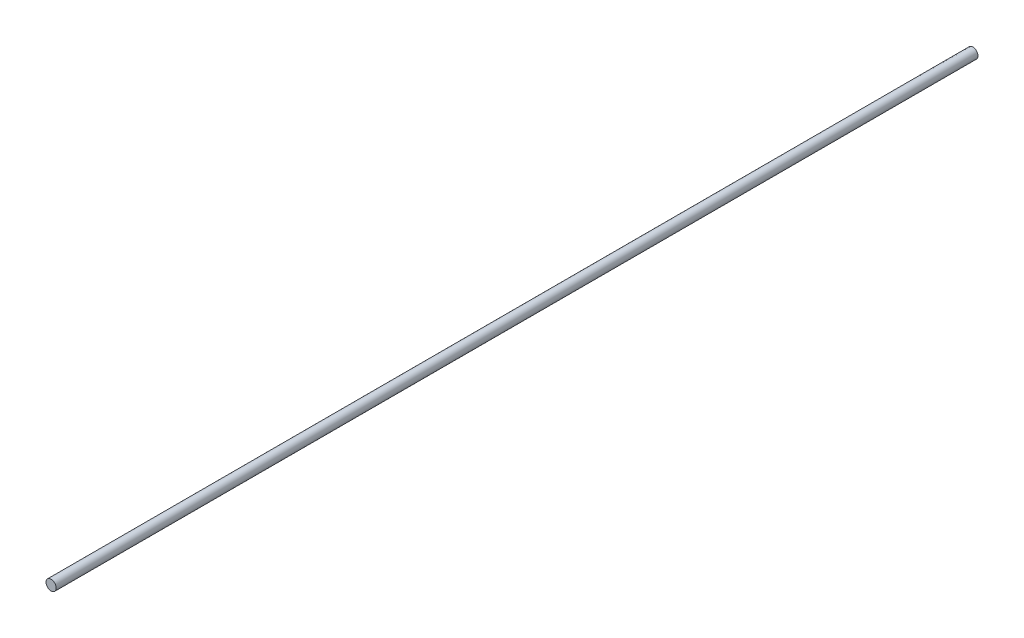
ISO-10303-21;
HEADER;
FILE_DESCRIPTION(('STEP AP214'),'2;1');
FILE_NAME('part.step','',(''),(''),'','','');
FILE_SCHEMA(('AUTOMOTIVE_DESIGN { 1 0 10303 214 1 1 1 1 }'));
ENDSEC;
DATA;
#1=APPLICATION_CONTEXT('core data for automotive mechanical design processes');
#2=APPLICATION_PROTOCOL_DEFINITION('international standard','automotive_design',2000,#1);
#3=PRODUCT_CONTEXT('',#1,'mechanical');
#4=PRODUCT('Part','Part','',(#3));
#5=PRODUCT_RELATED_PRODUCT_CATEGORY('part','',(#4));
#6=PRODUCT_DEFINITION_FORMATION('','',#4);
#7=PRODUCT_DEFINITION_CONTEXT('part definition',#1,'design');
#8=PRODUCT_DEFINITION('design','',#6,#7);
#9=PRODUCT_DEFINITION_SHAPE('','',#8);
#10=(LENGTH_UNIT() NAMED_UNIT(*) SI_UNIT(.MILLI.,.METRE.));
#11=(NAMED_UNIT(*) PLANE_ANGLE_UNIT() SI_UNIT($,.RADIAN.));
#12=(NAMED_UNIT(*) SI_UNIT($,.STERADIAN.) SOLID_ANGLE_UNIT());
#13=UNCERTAINTY_MEASURE_WITH_UNIT(LENGTH_MEASURE(1.E-05),#10,'distance_accuracy_value','');
#14=(GEOMETRIC_REPRESENTATION_CONTEXT(3) GLOBAL_UNCERTAINTY_ASSIGNED_CONTEXT((#13)) GLOBAL_UNIT_ASSIGNED_CONTEXT((#10,
#11,#12)) REPRESENTATION_CONTEXT('',''));
#15=CARTESIAN_POINT('',(0.,0.,0.));
#16=DIRECTION('',(0.,0.,1.));
#17=DIRECTION('',(1.,0.,0.));
#18=AXIS2_PLACEMENT_3D('',#15,#16,#17);
#19=CARTESIAN_POINT('',(0.,0.,722.));
#20=DIRECTION('',(0.,0.,-1.));
#21=DIRECTION('',(-1.,0.,0.));
#22=AXIS2_PLACEMENT_3D('',#19,#20,#21);
#23=CYLINDRICAL_SURFACE('',#22,4.);
#24=CARTESIAN_POINT('',(0.,0.,722.));
#25=DIRECTION('',(0.,0.,1.));
#26=DIRECTION('',(1.,0.,0.));
#27=AXIS2_PLACEMENT_3D('',#24,#25,#26);
#28=CIRCLE('',#27,4.);
#29=CARTESIAN_POINT('',(4.,0.,722.));
#30=VERTEX_POINT('',#29);
#31=EDGE_CURVE('E10',#30,#30,#28,.T.);
#32=ORIENTED_EDGE('',*,*,#31,.F.);
#33=EDGE_LOOP('',(#32));
#34=FACE_BOUND('',#33,.T.);
#35=CARTESIAN_POINT('',(0.,0.,0.));
#36=DIRECTION('',(0.,0.,1.));
#37=DIRECTION('',(1.,0.,0.));
#38=AXIS2_PLACEMENT_3D('',#35,#36,#37);
#39=CIRCLE('',#38,4.);
#40=CARTESIAN_POINT('',(4.,0.,0.));
#41=VERTEX_POINT('',#40);
#42=EDGE_CURVE('E36',#41,#41,#39,.T.);
#43=ORIENTED_EDGE('',*,*,#42,.T.);
#44=EDGE_LOOP('',(#43));
#45=FACE_BOUND('',#44,.T.);
#46=ADVANCED_FACE('F33',(#34,#45),#23,.T.);
#47=CARTESIAN_POINT('',(0.,0.,722.));
#48=DIRECTION('',(0.,0.,1.));
#49=DIRECTION('',(1.,0.,0.));
#50=AXIS2_PLACEMENT_3D('',#47,#48,#49);
#51=PLANE('',#50);
#52=ORIENTED_EDGE('',*,*,#31,.T.);
#53=EDGE_LOOP('',(#52));
#54=FACE_BOUND('',#53,.T.);
#55=ADVANCED_FACE('F48',(#54),#51,.T.);
#56=CARTESIAN_POINT('',(0.,0.,0.));
#57=DIRECTION('',(0.,0.,1.));
#58=DIRECTION('',(1.,0.,0.));
#59=AXIS2_PLACEMENT_3D('',#56,#57,#58);
#60=PLANE('',#59);
#61=ORIENTED_EDGE('',*,*,#42,.F.);
#62=EDGE_LOOP('',(#61));
#63=FACE_BOUND('',#62,.T.);
#64=ADVANCED_FACE('F46',(#63),#60,.F.);
#65=CLOSED_SHELL('',(#46,#55,#64));
#66=MANIFOLD_SOLID_BREP('B2',#65);
#67=ADVANCED_BREP_SHAPE_REPRESENTATION('',(#18,#66),#14);
#68=SHAPE_DEFINITION_REPRESENTATION(#9,#67);
ENDSEC;
END-ISO-10303-21;
